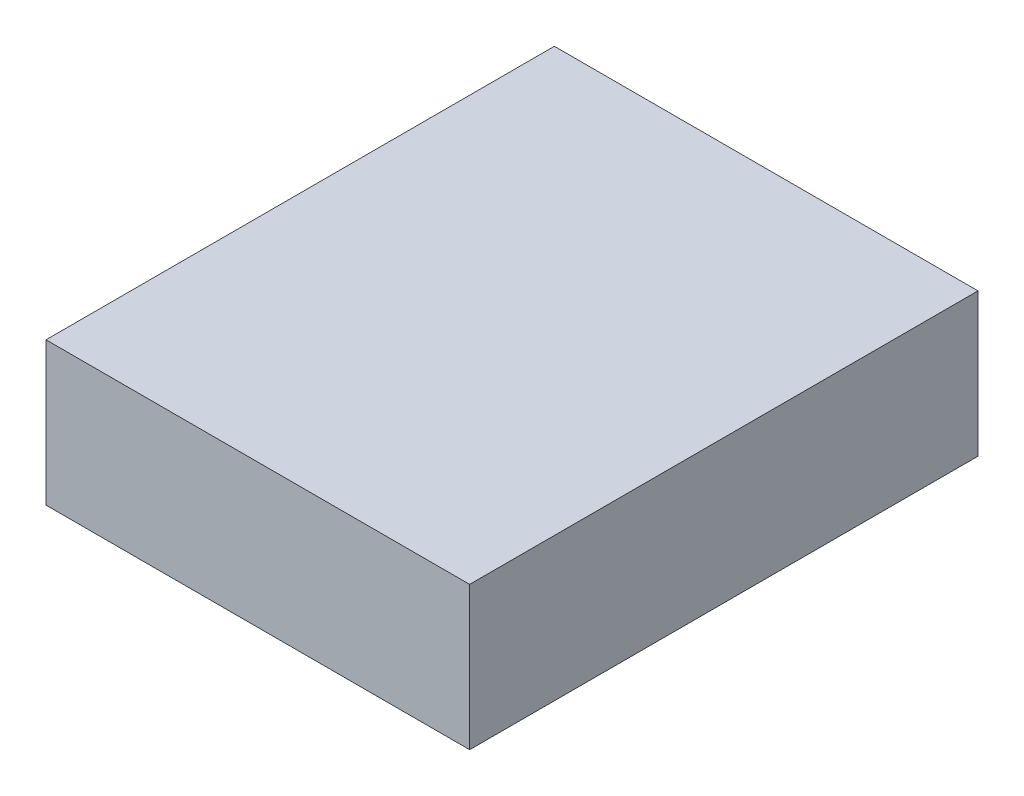
ISO-10303-21;
HEADER;
FILE_DESCRIPTION(('STEP AP214'),'2;1');
FILE_NAME('part.step','',(''),(''),'','','');
FILE_SCHEMA(('AUTOMOTIVE_DESIGN { 1 0 10303 214 1 1 1 1 }'));
ENDSEC;
DATA;
#1=APPLICATION_CONTEXT('core data for automotive mechanical design processes');
#2=APPLICATION_PROTOCOL_DEFINITION('international standard','automotive_design',2000,#1);
#3=PRODUCT_CONTEXT('',#1,'mechanical');
#4=PRODUCT('Part','Part','',(#3));
#5=PRODUCT_RELATED_PRODUCT_CATEGORY('part','',(#4));
#6=PRODUCT_DEFINITION_FORMATION('','',#4);
#7=PRODUCT_DEFINITION_CONTEXT('part definition',#1,'design');
#8=PRODUCT_DEFINITION('design','',#6,#7);
#9=PRODUCT_DEFINITION_SHAPE('','',#8);
#10=(LENGTH_UNIT() NAMED_UNIT(*) SI_UNIT(.MILLI.,.METRE.));
#11=(NAMED_UNIT(*) PLANE_ANGLE_UNIT() SI_UNIT($,.RADIAN.));
#12=(NAMED_UNIT(*) SI_UNIT($,.STERADIAN.) SOLID_ANGLE_UNIT());
#13=UNCERTAINTY_MEASURE_WITH_UNIT(LENGTH_MEASURE(1.E-05),#10,'distance_accuracy_value','');
#14=(GEOMETRIC_REPRESENTATION_CONTEXT(3) GLOBAL_UNCERTAINTY_ASSIGNED_CONTEXT((#13)) GLOBAL_UNIT_ASSIGNED_CONTEXT((#10,
#11,#12)) REPRESENTATION_CONTEXT('',''));
#15=CARTESIAN_POINT('',(0.,0.,0.));
#16=DIRECTION('',(0.,0.,1.));
#17=DIRECTION('',(1.,0.,0.));
#18=AXIS2_PLACEMENT_3D('',#15,#16,#17);
#19=CARTESIAN_POINT('',(25.,-8.45,60.));
#20=DIRECTION('',(-1.,0.,0.));
#21=DIRECTION('',(0.,0.,1.));
#22=AXIS2_PLACEMENT_3D('',#19,#20,#21);
#23=PLANE('',#22);
#24=DIRECTION('',(0.,1.,0.));
#25=VECTOR('',#24,1.);
#26=CARTESIAN_POINT('',(25.,-8.45,0.));
#27=LINE('',#26,#25);
#28=CARTESIAN_POINT('',(25.,-8.45,0.));
#29=VERTEX_POINT('',#28);
#30=CARTESIAN_POINT('',(25.,8.45,0.));
#31=VERTEX_POINT('',#30);
#32=EDGE_CURVE('E107',#29,#31,#27,.T.);
#33=ORIENTED_EDGE('',*,*,#32,.T.);
#34=DIRECTION('',(0.,0.,-1.));
#35=VECTOR('',#34,1.);
#36=CARTESIAN_POINT('',(25.,8.45,60.));
#37=LINE('',#36,#35);
#38=CARTESIAN_POINT('',(25.,8.45,60.));
#39=VERTEX_POINT('',#38);
#40=EDGE_CURVE('E11',#39,#31,#37,.T.);
#41=ORIENTED_EDGE('',*,*,#40,.F.);
#42=DIRECTION('',(0.,1.,0.));
#43=VECTOR('',#42,1.);
#44=CARTESIAN_POINT('',(25.,-8.45,60.));
#45=LINE('',#44,#43);
#46=CARTESIAN_POINT('',(25.,-8.45,60.));
#47=VERTEX_POINT('',#46);
#48=EDGE_CURVE('E91',#47,#39,#45,.T.);
#49=ORIENTED_EDGE('',*,*,#48,.F.);
#50=DIRECTION('',(0.,0.,-1.));
#51=VECTOR('',#50,1.);
#52=CARTESIAN_POINT('',(25.,-8.45,60.));
#53=LINE('',#52,#51);
#54=EDGE_CURVE('E103',#47,#29,#53,.T.);
#55=ORIENTED_EDGE('',*,*,#54,.T.);
#56=EDGE_LOOP('',(#33,#41,#49,#55));
#57=FACE_BOUND('',#56,.T.);
#58=ADVANCED_FACE('F39',(#57),#23,.F.);
#59=CARTESIAN_POINT('',(-25.,8.45,60.));
#60=DIRECTION('',(0.,-1.,0.));
#61=DIRECTION('',(0.,0.,-1.));
#62=AXIS2_PLACEMENT_3D('',#59,#60,#61);
#63=PLANE('',#62);
#64=DIRECTION('',(-1.,0.,0.));
#65=VECTOR('',#64,1.);
#66=CARTESIAN_POINT('',(-25.,8.45,0.));
#67=LINE('',#66,#65);
#68=CARTESIAN_POINT('',(-25.,8.45,0.));
#69=VERTEX_POINT('',#68);
#70=EDGE_CURVE('E96',#31,#69,#67,.T.);
#71=ORIENTED_EDGE('',*,*,#70,.T.);
#72=DIRECTION('',(0.,0.,-1.));
#73=VECTOR('',#72,1.);
#74=CARTESIAN_POINT('',(-25.,8.45,60.));
#75=LINE('',#74,#73);
#76=CARTESIAN_POINT('',(-25.,8.45,60.));
#77=VERTEX_POINT('',#76);
#78=EDGE_CURVE('E48',#77,#69,#75,.T.);
#79=ORIENTED_EDGE('',*,*,#78,.F.);
#80=DIRECTION('',(-1.,0.,0.));
#81=VECTOR('',#80,1.);
#82=CARTESIAN_POINT('',(-25.,8.45,60.));
#83=LINE('',#82,#81);
#84=EDGE_CURVE('E86',#39,#77,#83,.T.);
#85=ORIENTED_EDGE('',*,*,#84,.F.);
#86=ORIENTED_EDGE('',*,*,#40,.T.);
#87=EDGE_LOOP('',(#71,#79,#85,#86));
#88=FACE_BOUND('',#87,.T.);
#89=ADVANCED_FACE('F95',(#88),#63,.F.);
#90=CARTESIAN_POINT('',(-25.,-8.45,60.));
#91=DIRECTION('',(1.,0.,0.));
#92=DIRECTION('',(0.,0.,-1.));
#93=AXIS2_PLACEMENT_3D('',#90,#91,#92);
#94=PLANE('',#93);
#95=DIRECTION('',(0.,-1.,0.));
#96=VECTOR('',#95,1.);
#97=CARTESIAN_POINT('',(-25.,-8.45,0.));
#98=LINE('',#97,#96);
#99=CARTESIAN_POINT('',(-25.,-8.45,0.));
#100=VERTEX_POINT('',#99);
#101=EDGE_CURVE('E73',#69,#100,#98,.T.);
#102=ORIENTED_EDGE('',*,*,#101,.T.);
#103=DIRECTION('',(0.,0.,-1.));
#104=VECTOR('',#103,1.);
#105=CARTESIAN_POINT('',(-25.,-8.45,60.));
#106=LINE('',#105,#104);
#107=CARTESIAN_POINT('',(-25.,-8.45,60.));
#108=VERTEX_POINT('',#107);
#109=EDGE_CURVE('E98',#108,#100,#106,.T.);
#110=ORIENTED_EDGE('',*,*,#109,.F.);
#111=DIRECTION('',(0.,-1.,0.));
#112=VECTOR('',#111,1.);
#113=CARTESIAN_POINT('',(-25.,-8.45,60.));
#114=LINE('',#113,#112);
#115=EDGE_CURVE('E89',#77,#108,#114,.T.);
#116=ORIENTED_EDGE('',*,*,#115,.F.);
#117=ORIENTED_EDGE('',*,*,#78,.T.);
#118=EDGE_LOOP('',(#102,#110,#116,#117));
#119=FACE_BOUND('',#118,.T.);
#120=ADVANCED_FACE('F99',(#119),#94,.F.);
#121=CARTESIAN_POINT('',(-25.,-8.45,60.));
#122=DIRECTION('',(0.,1.,0.));
#123=DIRECTION('',(0.,0.,1.));
#124=AXIS2_PLACEMENT_3D('',#121,#122,#123);
#125=PLANE('',#124);
#126=DIRECTION('',(1.,0.,0.));
#127=VECTOR('',#126,1.);
#128=CARTESIAN_POINT('',(-25.,-8.45,0.));
#129=LINE('',#128,#127);
#130=EDGE_CURVE('E79',#100,#29,#129,.T.);
#131=ORIENTED_EDGE('',*,*,#130,.T.);
#132=ORIENTED_EDGE('',*,*,#54,.F.);
#133=DIRECTION('',(1.,0.,0.));
#134=VECTOR('',#133,1.);
#135=CARTESIAN_POINT('',(-25.,-8.45,60.));
#136=LINE('',#135,#134);
#137=EDGE_CURVE('E56',#108,#47,#136,.T.);
#138=ORIENTED_EDGE('',*,*,#137,.F.);
#139=ORIENTED_EDGE('',*,*,#109,.T.);
#140=EDGE_LOOP('',(#131,#132,#138,#139));
#141=FACE_BOUND('',#140,.T.);
#142=ADVANCED_FACE('F120',(#141),#125,.F.);
#143=CARTESIAN_POINT('',(0.,0.,60.));
#144=DIRECTION('',(0.,0.,-1.));
#145=DIRECTION('',(-1.,0.,0.));
#146=AXIS2_PLACEMENT_3D('',#143,#144,#145);
#147=PLANE('',#146);
#148=ORIENTED_EDGE('',*,*,#48,.T.);
#149=ORIENTED_EDGE('',*,*,#84,.T.);
#150=ORIENTED_EDGE('',*,*,#115,.T.);
#151=ORIENTED_EDGE('',*,*,#137,.T.);
#152=EDGE_LOOP('',(#148,#149,#150,#151));
#153=FACE_BOUND('',#152,.T.);
#154=ADVANCED_FACE('F87',(#153),#147,.F.);
#155=CARTESIAN_POINT('',(0.,0.,0.));
#156=DIRECTION('',(0.,0.,-1.));
#157=DIRECTION('',(-1.,0.,0.));
#158=AXIS2_PLACEMENT_3D('',#155,#156,#157);
#159=PLANE('',#158);
#160=ORIENTED_EDGE('',*,*,#32,.F.);
#161=ORIENTED_EDGE('',*,*,#130,.F.);
#162=ORIENTED_EDGE('',*,*,#101,.F.);
#163=ORIENTED_EDGE('',*,*,#70,.F.);
#164=EDGE_LOOP('',(#160,#161,#162,#163));
#165=FACE_BOUND('',#164,.T.);
#166=ADVANCED_FACE('F123',(#165),#159,.T.);
#167=CLOSED_SHELL('',(#58,#89,#120,#142,#154,#166));
#168=MANIFOLD_SOLID_BREP('B2',#167);
#169=ADVANCED_BREP_SHAPE_REPRESENTATION('',(#18,#168),#14);
#170=SHAPE_DEFINITION_REPRESENTATION(#9,#169);
ENDSEC;
END-ISO-10303-21;
